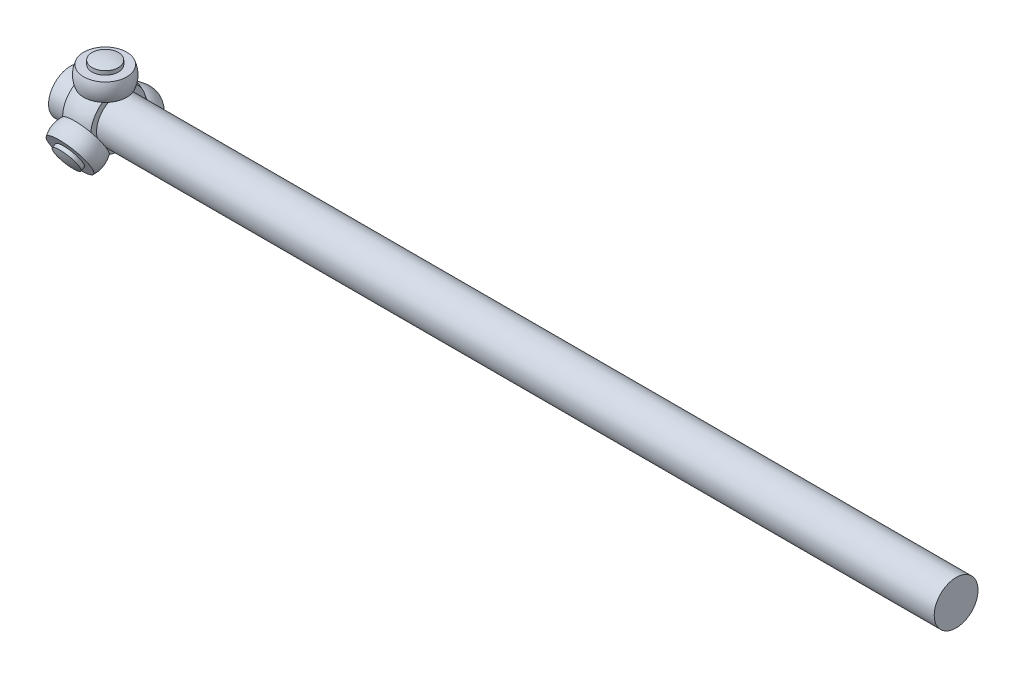
ISO-10303-21;
HEADER;
FILE_DESCRIPTION(('STEP AP214'),'2;1');
FILE_NAME('part.step','',(''),(''),'','','');
FILE_SCHEMA(('AUTOMOTIVE_DESIGN { 1 0 10303 214 1 1 1 1 }'));
ENDSEC;
DATA;
#1=APPLICATION_CONTEXT('core data for automotive mechanical design processes');
#2=APPLICATION_PROTOCOL_DEFINITION('international standard','automotive_design',2000,#1);
#3=PRODUCT_CONTEXT('',#1,'mechanical');
#4=PRODUCT('Part','Part','',(#3));
#5=PRODUCT_RELATED_PRODUCT_CATEGORY('part','',(#4));
#6=PRODUCT_DEFINITION_FORMATION('','',#4);
#7=PRODUCT_DEFINITION_CONTEXT('part definition',#1,'design');
#8=PRODUCT_DEFINITION('design','',#6,#7);
#9=PRODUCT_DEFINITION_SHAPE('','',#8);
#10=(LENGTH_UNIT() NAMED_UNIT(*) SI_UNIT(.MILLI.,.METRE.));
#11=(NAMED_UNIT(*) PLANE_ANGLE_UNIT() SI_UNIT($,.RADIAN.));
#12=(NAMED_UNIT(*) SI_UNIT($,.STERADIAN.) SOLID_ANGLE_UNIT());
#13=UNCERTAINTY_MEASURE_WITH_UNIT(LENGTH_MEASURE(1.E-05),#10,'distance_accuracy_value','');
#14=(GEOMETRIC_REPRESENTATION_CONTEXT(3) GLOBAL_UNCERTAINTY_ASSIGNED_CONTEXT((#13)) GLOBAL_UNIT_ASSIGNED_CONTEXT((#10,
#11,#12)) REPRESENTATION_CONTEXT('',''));
#15=CARTESIAN_POINT('',(0.,0.,0.));
#16=DIRECTION('',(0.,0.,1.));
#17=DIRECTION('',(1.,0.,0.));
#18=AXIS2_PLACEMENT_3D('',#15,#16,#17);
#19=CARTESIAN_POINT('',(0.,0.,0.));
#20=DIRECTION('',(-1.,0.,0.));
#21=DIRECTION('',(0.,1.,0.));
#22=AXIS2_PLACEMENT_3D('',#19,#20,#21);
#23=SPHERICAL_SURFACE('',#22,17.5);
#24=CARTESIAN_POINT('',(7.54091983227916,0.,0.));
#25=DIRECTION('',(-1.,0.,0.));
#26=DIRECTION('',(0.,0.,1.));
#27=AXIS2_PLACEMENT_3D('',#24,#25,#26);
#28=CIRCLE('',#27,15.7919133762549);
#29=CARTESIAN_POINT('',(7.54091983227916,13.11,-8.8041142702227));
#30=VERTEX_POINT('',#29);
#31=CARTESIAN_POINT('',(7.54091983227916,1.06958661583387,-15.7556501787254));
#32=VERTEX_POINT('',#31);
#33=EDGE_CURVE('E108',#30,#32,#28,.T.);
#34=ORIENTED_EDGE('',*,*,#33,.T.);
#35=CARTESIAN_POINT('',(0.,-6.55500000000005,-11.353593043614));
#36=DIRECTION('',(0.,0.500000000000004,0.866025403784436));
#37=DIRECTION('',(0.,-0.866025403784436,0.500000000000004));
#38=AXIS2_PLACEMENT_3D('',#35,#36,#37);
#39=CIRCLE('',#38,11.5921482047117);
#40=CARTESIAN_POINT('',(-9.72222222222222,-1.08762208217728,-14.5101851562304));
#41=VERTEX_POINT('',#40);
#42=EDGE_CURVE('E58',#32,#41,#39,.T.);
#43=ORIENTED_EDGE('',*,*,#42,.T.);
#44=CARTESIAN_POINT('',(-9.72222222222222,0.,0.));
#45=DIRECTION('',(-1.,0.,0.));
#46=DIRECTION('',(0.,0.,1.));
#47=AXIS2_PLACEMENT_3D('',#44,#45,#46);
#48=CIRCLE('',#47,14.5508898374542);
#49=CARTESIAN_POINT('',(-9.72222222222222,13.11,-6.31318422523282));
#50=VERTEX_POINT('',#49);
#51=EDGE_CURVE('E121',#50,#41,#48,.T.);
#52=ORIENTED_EDGE('',*,*,#51,.F.);
#53=CARTESIAN_POINT('',(0.,13.11,0.));
#54=DIRECTION('',(0.,-1.,0.));
#55=DIRECTION('',(0.,0.,-1.));
#56=AXIS2_PLACEMENT_3D('',#53,#54,#55);
#57=CIRCLE('',#56,11.5921482047117);
#58=EDGE_CURVE('E109',#50,#30,#57,.T.);
#59=ORIENTED_EDGE('',*,*,#58,.T.);
#60=EDGE_LOOP('',(#34,#43,#52,#59));
#61=FACE_BOUND('',#60,.T.);
#62=ADVANCED_FACE('F35',(#61),#23,.T.);
#63=CARTESIAN_POINT('',(-9.72222222222222,-12.0223779178228,-8.19700093099754));
#64=VERTEX_POINT('',#63);
#65=CARTESIAN_POINT('',(-9.72222222222222,-12.0223779178227,8.19700093099769));
#66=VERTEX_POINT('',#65);
#67=EDGE_CURVE('E119',#64,#66,#48,.T.);
#68=ORIENTED_EDGE('',*,*,#67,.F.);
#69=CARTESIAN_POINT('',(7.54091983227916,-14.179586615834,-6.95153590850256));
#70=VERTEX_POINT('',#69);
#71=EDGE_CURVE('E136',#64,#70,#39,.T.);
#72=ORIENTED_EDGE('',*,*,#71,.T.);
#73=CARTESIAN_POINT('',(7.54091983227916,-14.1795866158339,6.95153590850278));
#74=VERTEX_POINT('',#73);
#75=EDGE_CURVE('E105',#70,#74,#28,.T.);
#76=ORIENTED_EDGE('',*,*,#75,.T.);
#77=CARTESIAN_POINT('',(0.,-6.55499999999989,11.3535930436141));
#78=DIRECTION('',(0.,0.499999999999992,-0.866025403784443));
#79=DIRECTION('',(0.,0.866025403784443,0.499999999999992));
#80=AXIS2_PLACEMENT_3D('',#77,#78,#79);
#81=CIRCLE('',#80,11.5921482047117);
#82=EDGE_CURVE('E50',#74,#66,#81,.T.);
#83=ORIENTED_EDGE('',*,*,#82,.T.);
#84=EDGE_LOOP('',(#68,#72,#76,#83));
#85=FACE_BOUND('',#84,.T.);
#86=ADVANCED_FACE('F135',(#85),#23,.T.);
#87=CARTESIAN_POINT('',(-9.72222222222222,-1.08762208217707,14.5101851562304));
#88=VERTEX_POINT('',#87);
#89=CARTESIAN_POINT('',(-9.72222222222222,13.11,6.31318422523282));
#90=VERTEX_POINT('',#89);
#91=EDGE_CURVE('E98',#88,#90,#48,.T.);
#92=ORIENTED_EDGE('',*,*,#91,.F.);
#93=CARTESIAN_POINT('',(7.54091983227916,1.06958661583411,15.7556501787253));
#94=VERTEX_POINT('',#93);
#95=EDGE_CURVE('E86',#88,#94,#81,.T.);
#96=ORIENTED_EDGE('',*,*,#95,.T.);
#97=CARTESIAN_POINT('',(7.54091983227916,13.11,8.8041142702227));
#98=VERTEX_POINT('',#97);
#99=EDGE_CURVE('E96',#94,#98,#28,.T.);
#100=ORIENTED_EDGE('',*,*,#99,.T.);
#101=EDGE_CURVE('E106',#98,#90,#57,.T.);
#102=ORIENTED_EDGE('',*,*,#101,.T.);
#103=EDGE_LOOP('',(#92,#96,#100,#102));
#104=FACE_BOUND('',#103,.T.);
#105=ADVANCED_FACE('F37',(#104),#23,.T.);
#106=CARTESIAN_POINT('',(-9.72222222222222,14.5508898374542,0.));
#107=DIRECTION('',(1.,0.,0.));
#108=DIRECTION('',(0.,0.,-1.));
#109=AXIS2_PLACEMENT_3D('',#106,#107,#108);
#110=PLANE('',#109);
#111=CARTESIAN_POINT('',(-9.72222222222222,0.,0.));
#112=DIRECTION('',(-1.,0.,0.));
#113=DIRECTION('',(0.,0.,1.));
#114=AXIS2_PLACEMENT_3D('',#111,#112,#113);
#115=CIRCLE('',#114,12.5);
#116=CARTESIAN_POINT('',(-9.72222222222222,0.,12.5));
#117=VERTEX_POINT('',#116);
#118=EDGE_CURVE('E113',#117,#117,#115,.T.);
#119=ORIENTED_EDGE('',*,*,#118,.F.);
#120=EDGE_LOOP('',(#119));
#121=FACE_BOUND('',#120,.T.);
#122=ORIENTED_EDGE('',*,*,#51,.T.);
#123=DIRECTION('',(0.,-0.866025403784436,0.500000000000004));
#124=VECTOR('',#123,1.);
#125=CARTESIAN_POINT('',(-9.72222222222222,4.35816737809055,-17.6543131670661));
#126=LINE('',#125,#124);
#127=EDGE_CURVE('E132',#41,#64,#126,.T.);
#128=ORIENTED_EDGE('',*,*,#127,.T.);
#129=ORIENTED_EDGE('',*,*,#67,.T.);
#130=DIRECTION('',(0.,0.866025403784443,0.499999999999992));
#131=VECTOR('',#130,1.);
#132=CARTESIAN_POINT('',(-9.72222222222222,4.35816737809088,17.6543131670661));
#133=LINE('',#132,#131);
#134=EDGE_CURVE('E131',#66,#88,#133,.T.);
#135=ORIENTED_EDGE('',*,*,#134,.T.);
#136=ORIENTED_EDGE('',*,*,#91,.T.);
#137=DIRECTION('',(0.,0.,-1.));
#138=VECTOR('',#137,1.);
#139=CARTESIAN_POINT('',(-9.72222222222222,13.11,17.1836611079422));
#140=LINE('',#139,#138);
#141=EDGE_CURVE('E155',#90,#50,#140,.T.);
#142=ORIENTED_EDGE('',*,*,#141,.T.);
#143=EDGE_LOOP('',(#122,#128,#129,#135,#136,#142));
#144=FACE_BOUND('',#143,.T.);
#145=ADVANCED_FACE('F130',(#121,#144),#110,.F.);
#146=CARTESIAN_POINT('',(7.54091983227916,12.5,0.));
#147=DIRECTION('',(-1.,0.,0.));
#148=DIRECTION('',(0.,0.,1.));
#149=AXIS2_PLACEMENT_3D('',#146,#147,#148);
#150=PLANE('',#149);
#151=ORIENTED_EDGE('',*,*,#75,.F.);
#152=DIRECTION('',(0.,0.866025403784436,-0.500000000000004));
#153=VECTOR('',#152,1.);
#154=CARTESIAN_POINT('',(7.54091983227916,2.8199999999999,-16.7662518172667));
#155=LINE('',#154,#153);
#156=EDGE_CURVE('E12',#70,#32,#155,.T.);
#157=ORIENTED_EDGE('',*,*,#156,.T.);
#158=ORIENTED_EDGE('',*,*,#33,.F.);
#159=DIRECTION('',(0.,0.,1.));
#160=VECTOR('',#159,1.);
#161=CARTESIAN_POINT('',(7.54091983227916,13.11,0.));
#162=LINE('',#161,#160);
#163=EDGE_CURVE('E92',#30,#98,#162,.T.);
#164=ORIENTED_EDGE('',*,*,#163,.T.);
#165=ORIENTED_EDGE('',*,*,#99,.F.);
#166=DIRECTION('',(0.,-0.866025403784443,-0.499999999999992));
#167=VECTOR('',#166,1.);
#168=CARTESIAN_POINT('',(7.54091983227916,2.8200000000002,16.7662518172667));
#169=LINE('',#168,#167);
#170=EDGE_CURVE('E43',#94,#74,#169,.T.);
#171=ORIENTED_EDGE('',*,*,#170,.T.);
#172=EDGE_LOOP('',(#151,#157,#158,#164,#165,#171));
#173=FACE_BOUND('',#172,.T.);
#174=CARTESIAN_POINT('',(7.54091983227917,0.,0.));
#175=DIRECTION('',(-1.,0.,0.));
#176=DIRECTION('',(0.,0.,1.));
#177=AXIS2_PLACEMENT_3D('',#174,#175,#176);
#178=CIRCLE('',#177,12.5);
#179=CARTESIAN_POINT('',(7.54091983227917,0.,12.5));
#180=VERTEX_POINT('',#179);
#181=EDGE_CURVE('E250',#180,#180,#178,.T.);
#182=ORIENTED_EDGE('',*,*,#181,.T.);
#183=EDGE_LOOP('',(#182));
#184=FACE_BOUND('',#183,.T.);
#185=ADVANCED_FACE('F102',(#173,#184),#150,.F.);
#186=CARTESIAN_POINT('',(0.,13.11,-7.47850270471022));
#187=DIRECTION('',(0.,1.,0.));
#188=DIRECTION('',(0.,0.,1.));
#189=AXIS2_PLACEMENT_3D('',#186,#187,#188);
#190=PLANE('',#189);
#191=CARTESIAN_POINT('',(0.,13.11,0.));
#192=DIRECTION('',(0.,1.,0.));
#193=DIRECTION('',(0.,0.,1.));
#194=AXIS2_PLACEMENT_3D('',#191,#192,#193);
#195=CIRCLE('',#194,12.2540156683432);
#196=CARTESIAN_POINT('',(0.,13.11,-12.2540156683432));
#197=VERTEX_POINT('',#196);
#198=EDGE_CURVE('E149',#197,#197,#195,.T.);
#199=ORIENTED_EDGE('',*,*,#198,.F.);
#200=EDGE_LOOP('',(#199));
#201=FACE_BOUND('',#200,.T.);
#202=ORIENTED_EDGE('',*,*,#58,.F.);
#203=ORIENTED_EDGE('',*,*,#141,.F.);
#204=ORIENTED_EDGE('',*,*,#101,.F.);
#205=ORIENTED_EDGE('',*,*,#163,.F.);
#206=EDGE_LOOP('',(#202,#203,#204,#205));
#207=FACE_BOUND('',#206,.T.);
#208=ADVANCED_FACE('F188',(#201,#207),#190,.F.);
#209=CARTESIAN_POINT('',(0.,18.15,0.));
#210=DIRECTION('',(0.,1.,0.));
#211=DIRECTION('',(0.,0.,-1.));
#212=AXIS2_PLACEMENT_3D('',#209,#210,#211);
#213=SPHERICAL_SURFACE('',#212,13.25);
#214=CARTESIAN_POINT('',(0.,23.19,0.));
#215=DIRECTION('',(0.,1.,0.));
#216=DIRECTION('',(0.,0.,1.));
#217=AXIS2_PLACEMENT_3D('',#214,#215,#216);
#218=CIRCLE('',#217,12.2540156683432);
#219=CARTESIAN_POINT('',(0.,23.19,-12.2540156683432));
#220=VERTEX_POINT('',#219);
#221=EDGE_CURVE('E146',#220,#220,#218,.T.);
#222=CARTESIAN_POINT('',(0.,23.19,-12.2540156683432));
#223=CARTESIAN_POINT('',(0.,23.0903840691902,-12.2949873808712));
#224=CARTESIAN_POINT('',(0.,22.9902683386837,-12.3347438730989));
#225=CARTESIAN_POINT('',(0.,22.7890972612106,-12.4118039229785));
#226=CARTESIAN_POINT('',(0.,22.688041914244,-12.4491074806305));
#227=CARTESIAN_POINT('',(0.,22.4850515867848,-12.5212391673838));
#228=CARTESIAN_POINT('',(0.,22.3831166062921,-12.5560672964851));
#229=CARTESIAN_POINT('',(0.,22.1784276675977,-12.6232274952789));
#230=CARTESIAN_POINT('',(0.,22.075673709396,-12.6555595649714));
#231=CARTESIAN_POINT('',(0.,21.8694079180531,-12.7177083938399));
#232=CARTESIAN_POINT('',(0.,21.7658960849119,-12.7475251530158));
#233=CARTESIAN_POINT('',(0.,21.5581761079436,-12.8046256337488));
#234=CARTESIAN_POINT('',(0.,21.4539679641166,-12.8319093553057));
#235=CARTESIAN_POINT('',(0.,21.2449173412693,-12.8839275326611));
#236=CARTESIAN_POINT('',(0.,21.140074862249,-12.9086619884596));
#237=CARTESIAN_POINT('',(0.,20.9298179225403,-12.9555669243079));
#238=CARTESIAN_POINT('',(0.,20.8244034618518,-12.9777374043577));
#239=CARTESIAN_POINT('',(0.,20.6130652523017,-13.0195012030616));
#240=CARTESIAN_POINT('',(0.,20.5071415034401,-13.0390945217157));
#241=CARTESIAN_POINT('',(0.,20.2948477139849,-13.0756923448507));
#242=CARTESIAN_POINT('',(0.,20.1884776733914,-13.0926968493315));
#243=CARTESIAN_POINT('',(0.,19.9753545623237,-13.1241069309589));
#244=CARTESIAN_POINT('',(0.,19.8686014918495,-13.1385125081054));
#245=CARTESIAN_POINT('',(0.,19.6547758106764,-13.1647161675831));
#246=CARTESIAN_POINT('',(0.,19.5477031999776,-13.1765142499144));
#247=CARTESIAN_POINT('',(0.,19.3333021180514,-13.1974959030431));
#248=CARTESIAN_POINT('',(0.,19.2259736468242,-13.2066794738407));
#249=CARTESIAN_POINT('',(0.,19.0111246757067,-13.2224266421226));
#250=CARTESIAN_POINT('',(0.,18.9036041758166,-13.228990239607));
#251=CARTESIAN_POINT('',(0.,18.6884350934446,-13.2394935576695));
#252=CARTESIAN_POINT('',(0.,18.5807865109628,-13.2434332782476));
#253=CARTESIAN_POINT('',(0.,18.365425285654,-13.2486864994129));
#254=CARTESIAN_POINT('',(0.,18.257712642827,-13.25));
#255=CARTESIAN_POINT('',(0.,18.042287357173,-13.25));
#256=CARTESIAN_POINT('',(0.,17.934574714346,-13.2486864994129));
#257=CARTESIAN_POINT('',(0.,17.7192134890372,-13.2434332782476));
#258=CARTESIAN_POINT('',(0.,17.6115649065554,-13.2394935576695));
#259=CARTESIAN_POINT('',(0.,17.3963958241834,-13.228990239607));
#260=CARTESIAN_POINT('',(0.,17.2888753242933,-13.2224266421226));
#261=CARTESIAN_POINT('',(0.,17.0740263531758,-13.2066794738407));
#262=CARTESIAN_POINT('',(0.,16.9666978819486,-13.1974959030431));
#263=CARTESIAN_POINT('',(0.,16.7522968000224,-13.1765142499144));
#264=CARTESIAN_POINT('',(0.,16.6452241893236,-13.1647161675831));
#265=CARTESIAN_POINT('',(0.,16.4313985081505,-13.1385125081054));
#266=CARTESIAN_POINT('',(0.,16.3246454376763,-13.1241069309589));
#267=CARTESIAN_POINT('',(0.,16.1115223266086,-13.0926968493315));
#268=CARTESIAN_POINT('',(0.,16.0051522860151,-13.0756923448507));
#269=CARTESIAN_POINT('',(0.,15.7928584965599,-13.0390945217157));
#270=CARTESIAN_POINT('',(0.,15.6869347476983,-13.0195012030616));
#271=CARTESIAN_POINT('',(0.,15.4755965381482,-12.9777374043577));
#272=CARTESIAN_POINT('',(0.,15.3701820774597,-12.9555669243079));
#273=CARTESIAN_POINT('',(0.,15.159925137751,-12.9086619884596));
#274=CARTESIAN_POINT('',(0.,15.0550826587307,-12.8839275326611));
#275=CARTESIAN_POINT('',(0.,14.8460320358834,-12.8319093553057));
#276=CARTESIAN_POINT('',(0.,14.7418238920564,-12.8046256337487));
#277=CARTESIAN_POINT('',(0.,14.5341039150881,-12.7475251530158));
#278=CARTESIAN_POINT('',(0.,14.4305920819469,-12.7177083938398));
#279=CARTESIAN_POINT('',(0.,14.224326290604,-12.6555595649714));
#280=CARTESIAN_POINT('',(0.,14.1215723324023,-12.6232274952789));
#281=CARTESIAN_POINT('',(0.,13.9168833937079,-12.5560672964851));
#282=CARTESIAN_POINT('',(0.,13.8149484132152,-12.5212391673838));
#283=CARTESIAN_POINT('',(0.,13.6119580857559,-12.4491074806305));
#284=CARTESIAN_POINT('',(0.,13.5109027387894,-12.4118039229785));
#285=CARTESIAN_POINT('',(0.,13.3097316613163,-12.3347438730989));
#286=CARTESIAN_POINT('',(0.,13.2096159308098,-12.2949873808712));
#287=CARTESIAN_POINT('',(0.,13.11,-12.2540156683432));
#288=B_SPLINE_CURVE_WITH_KNOTS('',3,(#222,#223,#224,#225,#226,#227,#228,#229,#230,#231,#232,
#233,#234,#235,#236,#237,#238,#239,#240,#241,#242,#243,#244,#245,#246,#247,#248,#249,#250,#251,
#252,#253,#254,#255,#256,#257,#258,#259,#260,#261,#262,#263,#264,#265,#266,#267,#268,#269,#270,
#271,#272,#273,#274,#275,#276,#277,#278,#279,#280,#281,#282,#283,#284,#285,#286,#287),
.UNSPECIFIED.,.F.,.F.,(4,2,2,2,2,2,2,2,2,2,2,2,2,2,2,2,2,2,2,2,2,2,2,2,2,2,2,2,2,2,2,2,4),(0.,
0.323129921235588,0.646259842471182,0.969389763706772,1.29251968494236,1.61564960617796,
1.93877952741355,2.26190944864914,2.58503936988473,2.90816929112032,3.23129921235591,
3.5544291335915,3.87755905482709,4.20068897606268,4.52381889729827,4.84694881853386,
5.17007873976946,5.49320866100505,5.81633858224064,6.13946850347623,6.46259842471182,
6.78572834594741,7.10885826718301,7.4319881884186,7.75511810965419,8.07824803088978,
8.40137795212537,8.72450787336096,9.04763779459655,9.37076771583214,9.69389763706773,
10.0170275583033,10.3401574795389),.UNSPECIFIED.);
#289=EDGE_CURVE('BSEAM197',#220,#197,#288,.T.);
#290=ORIENTED_EDGE('',*,*,#221,.F.);
#291=ORIENTED_EDGE('',*,*,#198,.T.);
#292=ORIENTED_EDGE('',*,*,#289,.T.);
#293=ORIENTED_EDGE('',*,*,#289,.F.);
#294=EDGE_LOOP('',(#290,#292,#291,#293));
#295=FACE_BOUND('',#294,.T.);
#296=ADVANCED_FACE('F197',(#295),#213,.T.);
#297=CARTESIAN_POINT('',(0.,23.19,-7.47850270471022));
#298=DIRECTION('',(0.,-1.,0.));
#299=DIRECTION('',(0.,0.,-1.));
#300=AXIS2_PLACEMENT_3D('',#297,#298,#299);
#301=PLANE('',#300);
#302=CARTESIAN_POINT('',(0.,23.19,0.));
#303=DIRECTION('',(0.,1.,0.));
#304=DIRECTION('',(0.,0.,1.));
#305=AXIS2_PLACEMENT_3D('',#302,#303,#304);
#306=CIRCLE('',#305,7.47850270471022);
#307=CARTESIAN_POINT('',(0.,23.19,7.47850270471022));
#308=VERTEX_POINT('',#307);
#309=EDGE_CURVE('E143',#308,#308,#306,.T.);
#310=ORIENTED_EDGE('',*,*,#309,.F.);
#311=EDGE_LOOP('',(#310));
#312=FACE_BOUND('',#311,.T.);
#313=ORIENTED_EDGE('',*,*,#221,.T.);
#314=EDGE_LOOP('',(#313));
#315=FACE_BOUND('',#314,.T.);
#316=ADVANCED_FACE('F193',(#312,#315),#301,.F.);
#317=CARTESIAN_POINT('',(0.,0.,0.));
#318=DIRECTION('',(0.,-1.,0.));
#319=DIRECTION('',(0.,0.,-1.));
#320=AXIS2_PLACEMENT_3D('',#317,#318,#319);
#321=SPHERICAL_SURFACE('',#320,26.5);
#322=CARTESIAN_POINT('',(0.,25.4228636722074,0.));
#323=DIRECTION('',(0.,-1.,0.));
#324=DIRECTION('',(0.,0.,-1.));
#325=AXIS2_PLACEMENT_3D('',#322,#323,#324);
#326=CIRCLE('',#325,7.47850270471022);
#327=CARTESIAN_POINT('',(0.,25.4228636722074,-7.47850270471022));
#328=VERTEX_POINT('',#327);
#329=EDGE_CURVE('E152',#328,#328,#326,.T.);
#330=ORIENTED_EDGE('',*,*,#329,.F.);
#331=EDGE_LOOP('',(#330));
#332=FACE_BOUND('',#331,.T.);
#333=ADVANCED_FACE('F171',(#332),#321,.T.);
#334=CARTESIAN_POINT('',(0.,13.11,0.));
#335=DIRECTION('',(0.,1.,0.));
#336=DIRECTION('',(0.,0.,1.));
#337=AXIS2_PLACEMENT_3D('',#334,#335,#336);
#338=CYLINDRICAL_SURFACE('',#337,7.47850270471022);
#339=ORIENTED_EDGE('',*,*,#329,.T.);
#340=EDGE_LOOP('',(#339));
#341=FACE_BOUND('',#340,.T.);
#342=ORIENTED_EDGE('',*,*,#309,.T.);
#343=EDGE_LOOP('',(#342));
#344=FACE_BOUND('',#343,.T.);
#345=ADVANCED_FACE('F161',(#341,#344),#338,.T.);
#346=CARTESIAN_POINT('',(0.,-13.0315733245497,-7.61434169125882));
#347=DIRECTION('',(0.,-0.500000000000004,-0.866025403784436));
#348=DIRECTION('',(0.,0.866025403784436,-0.500000000000004));
#349=AXIS2_PLACEMENT_3D('',#346,#347,#348);
#350=PLANE('',#349);
#351=CARTESIAN_POINT('',(0.,-6.55500000000005,-11.353593043614));
#352=DIRECTION('',(0.,-0.500000000000004,-0.866025403784436));
#353=DIRECTION('',(0.,0.866025403784436,-0.500000000000004));
#354=AXIS2_PLACEMENT_3D('',#351,#352,#353);
#355=CIRCLE('',#354,12.2540156683432);
#356=CARTESIAN_POINT('',(0.,-17.1672888671578,-5.22658520944232));
#357=VERTEX_POINT('',#356);
#358=EDGE_CURVE('E230',#357,#357,#355,.T.);
#359=ORIENTED_EDGE('',*,*,#358,.F.);
#360=EDGE_LOOP('',(#359));
#361=FACE_BOUND('',#360,.T.);
#362=ORIENTED_EDGE('',*,*,#71,.F.);
#363=ORIENTED_EDGE('',*,*,#127,.F.);
#364=ORIENTED_EDGE('',*,*,#42,.F.);
#365=ORIENTED_EDGE('',*,*,#156,.F.);
#366=EDGE_LOOP('',(#362,#363,#364,#365));
#367=FACE_BOUND('',#366,.T.);
#368=ADVANCED_FACE('F158',(#361,#367),#350,.F.);
#369=CARTESIAN_POINT('',(0.,-9.07500000000008,-15.7183610786875));
#370=DIRECTION('',(0.,-0.500000000000004,-0.866025403784436));
#371=DIRECTION('',(0.,-0.866025403784436,0.500000000000004));
#372=AXIS2_PLACEMENT_3D('',#369,#370,#371);
#373=SPHERICAL_SURFACE('',#372,13.25);
#374=CARTESIAN_POINT('',(0.,-11.5950000000001,-20.0831291137611));
#375=DIRECTION('',(0.,-0.500000000000004,-0.866025403784436));
#376=DIRECTION('',(0.,0.866025403784436,-0.500000000000004));
#377=AXIS2_PLACEMENT_3D('',#374,#375,#376);
#378=CIRCLE('',#377,12.2540156683432);
#379=CARTESIAN_POINT('',(0.,-22.2072888671578,-13.9561212795894));
#380=VERTEX_POINT('',#379);
#381=EDGE_CURVE('E233',#380,#380,#378,.T.);
#382=CARTESIAN_POINT('',(0.,-22.2072888671578,-13.9561212795894));
#383=CARTESIAN_POINT('',(0.,-22.1929634456387,-13.8493654966225));
#384=CARTESIAN_POINT('',(0.,-22.17733571262,-13.7427844845716));
#385=CARTESIAN_POINT('',(0.,-22.1434861346961,-13.5300351960334));
#386=CARTESIAN_POINT('',(0.,-22.125264289791,-13.4238669195461));
#387=CARTESIAN_POINT('',(0.,-22.0862369992076,-13.2120062958672));
#388=CARTESIAN_POINT('',(0.,-22.0654315535292,-13.1063139486756));
#389=CARTESIAN_POINT('',(0.,-22.0212495224607,-12.8954680284957));
#390=CARTESIAN_POINT('',(0.,-21.9978729370705,-12.7903144555074));
#391=CARTESIAN_POINT('',(0.,-21.9485625060145,-12.5806086258385));
#392=CARTESIAN_POINT('',(0.,-21.9226286603488,-12.476056369158));
#393=CARTESIAN_POINT('',(0.,-21.8682191387477,-12.2676153518634));
#394=CARTESIAN_POINT('',(0.,-21.8397434628123,-12.1637265912495));
#395=CARTESIAN_POINT('',(0.,-21.780267214437,-11.9566743525091));
#396=CARTESIAN_POINT('',(0.,-21.7492666419971,-11.8535108743825));
#397=CARTESIAN_POINT('',(0.,-21.6847590381502,-11.6479705553487));
#398=CARTESIAN_POINT('',(0.,-21.6512520067432,-11.5455937144413));
#399=CARTESIAN_POINT('',(0.,-21.5817514126043,-11.3416875568286));
#400=CARTESIAN_POINT('',(0.,-21.5457578498724,-11.2401582401233));
#401=CARTESIAN_POINT('',(0.,-21.4713055997029,-11.038007513822));
#402=CARTESIAN_POINT('',(0.,-21.4328469122653,-10.937386104226));
#403=CARTESIAN_POINT('',(0.,-21.3534872853557,-10.7371110350941));
#404=CARTESIAN_POINT('',(0.,-21.3125863458836,-10.6374573755583));
#405=CARTESIAN_POINT('',(0.,-21.228366540077,-10.439177073942));
#406=CARTESIAN_POINT('',(0.,-21.1850476737423,-10.3405504318616));
#407=CARTESIAN_POINT('',(0.,-21.0960177774022,-10.1443828217504));
#408=CARTESIAN_POINT('',(0.,-21.0503067473967,-10.0468418537194));
#409=CARTESIAN_POINT('',(0.,-20.9565197096078,-9.85290360261384));
#410=CARTESIAN_POINT('',(0.,-20.9084437018244,-9.75650631953916));
#411=CARTESIAN_POINT('',(0.,-20.8099553009045,-9.56491276906479));
#412=CARTESIAN_POINT('',(0.,-20.7595429077681,-9.4697165016651));
#413=CARTESIAN_POINT('',(0.,-20.6564117180946,-9.28058159897492));
#414=CARTESIAN_POINT('',(0.,-20.6036929215574,-9.18664296368442));
#415=CARTESIAN_POINT('',(0.,-20.4959802787303,-9.00007919369052));
#416=CARTESIAN_POINT('',(0.,-20.4409864324405,-8.90745405898712));
#417=CARTESIAN_POINT('',(0.,-20.3287563968053,-8.72357237746218));
#418=CARTESIAN_POINT('',(0.,-20.2715202074599,-8.63231583064065));
#419=CARTESIAN_POINT('',(0.,-20.1548395260078,-8.4512255982288));
#420=CARTESIAN_POINT('',(0.,-20.095395033901,-8.3613919126385));
#421=CARTESIAN_POINT('',(0.,-19.9743331005725,-8.1832008298148));
#422=CARTESIAN_POINT('',(0.,-19.9127156593507,-8.09484343258142));
#423=CARTESIAN_POINT('',(0.,-19.7873444737648,-7.91965747559893));
#424=CARTESIAN_POINT('',(0.,-19.7235907294005,-7.83282891584982));
#425=CARTESIAN_POINT('',(0.,-19.5939848540342,-7.66075227371131));
#426=CARTESIAN_POINT('',(0.,-19.528132723032,-7.57550419132192));
#427=CARTESIAN_POINT('',(0.,-19.3943692388739,-7.40663920381738));
#428=CARTESIAN_POINT('',(0.,-19.326457885718,-7.32302229870224));
#429=CARTESIAN_POINT('',(0.,-19.1886163464323,-7.15746939553588));
#430=CARTESIAN_POINT('',(0.,-19.1186861603026,-7.07553339748466));
#431=CARTESIAN_POINT('',(0.,-18.9768485448914,-6.91339103857592));
#432=CARTESIAN_POINT('',(0.,-18.90494111561,-6.83318467771839));
#433=CARTESIAN_POINT('',(0.,-18.7591917797481,-6.6745492945328));
#434=CARTESIAN_POINT('',(0.,-18.6853498731677,-6.59612027220474));
#435=CARTESIAN_POINT('',(0.,-18.5357754986957,-6.44108621081971));
#436=CARTESIAN_POINT('',(0.,-18.4600430308041,-6.36448117176274));
#437=CARTESIAN_POINT('',(0.,-18.3067325754369,-6.21314063520115));
#438=CARTESIAN_POINT('',(0.,-18.2291545879614,-6.13840513769654));
#439=CARTESIAN_POINT('',(0.,-18.0721992276744,-5.99084813689611));
#440=CARTESIAN_POINT('',(0.,-17.992821854863,-5.9180266336003));
#441=CARTESIAN_POINT('',(0.,-17.8323149472371,-5.77434091221418));
#442=CARTESIAN_POINT('',(0.,-17.7511854124227,-5.70347669412388));
#443=CARTESIAN_POINT('',(0.,-17.5872223755469,-5.56374775719832));
#444=CARTESIAN_POINT('',(0.,-17.5043888734855,-5.49488303836307));
#445=CARTESIAN_POINT('',(0.,-17.3370673739363,-5.3591937997045));
#446=CARTESIAN_POINT('',(0.,-17.2525793764485,-5.2923692798812));
#447=CARTESIAN_POINT('',(0.,-17.1672888671578,-5.22658520944232));
#448=B_SPLINE_CURVE_WITH_KNOTS('',3,(#382,#383,#384,#385,#386,#387,#388,#389,#390,#391,#392,
#393,#394,#395,#396,#397,#398,#399,#400,#401,#402,#403,#404,#405,#406,#407,#408,#409,#410,#411,
#412,#413,#414,#415,#416,#417,#418,#419,#420,#421,#422,#423,#424,#425,#426,#427,#428,#429,#430,
#431,#432,#433,#434,#435,#436,#437,#438,#439,#440,#441,#442,#443,#444,#445,#446,#447),
.UNSPECIFIED.,.F.,.F.,(4,2,2,2,2,2,2,2,2,2,2,2,2,2,2,2,2,2,2,2,2,2,2,2,2,2,2,2,2,2,2,2,4),(0.,
0.323129921235591,0.646259842471183,0.969389763706774,1.29251968494237,1.61564960617796,
1.93877952741355,2.26190944864914,2.58503936988473,2.90816929112032,3.23129921235591,
3.5544291335915,3.87755905482709,4.20068897606269,4.52381889729828,4.84694881853387,
5.17007873976946,5.49320866100505,5.81633858224064,6.13946850347623,6.46259842471182,
6.78572834594741,7.10885826718301,7.4319881884186,7.75511810965419,8.07824803088978,
8.40137795212537,8.72450787336096,9.04763779459655,9.37076771583214,9.69389763706773,
10.0170275583033,10.3401574795389),.UNSPECIFIED.);
#449=EDGE_CURVE('BSEAM160',#380,#357,#448,.T.);
#450=ORIENTED_EDGE('',*,*,#381,.F.);
#451=ORIENTED_EDGE('',*,*,#358,.T.);
#452=ORIENTED_EDGE('',*,*,#449,.T.);
#453=ORIENTED_EDGE('',*,*,#449,.F.);
#454=EDGE_LOOP('',(#450,#452,#451,#453));
#455=FACE_BOUND('',#454,.T.);
#456=ADVANCED_FACE('F160',(#455),#373,.T.);
#457=CARTESIAN_POINT('',(0.,-18.0715733245498,-16.3438777614059));
#458=DIRECTION('',(0.,0.500000000000004,0.866025403784436));
#459=DIRECTION('',(0.,-0.866025403784436,0.500000000000004));
#460=AXIS2_PLACEMENT_3D('',#457,#458,#459);
#461=PLANE('',#460);
#462=CARTESIAN_POINT('',(0.,-11.5950000000001,-20.0831291137611));
#463=DIRECTION('',(0.,-0.500000000000004,-0.866025403784436));
#464=DIRECTION('',(0.,0.866025403784436,-0.500000000000004));
#465=AXIS2_PLACEMENT_3D('',#462,#463,#464);
#466=CIRCLE('',#465,7.47850270471022);
#467=CARTESIAN_POINT('',(0.,-5.11842667545043,-23.8223804661162));
#468=VERTEX_POINT('',#467);
#469=EDGE_CURVE('E238',#468,#468,#466,.T.);
#470=ORIENTED_EDGE('',*,*,#469,.F.);
#471=EDGE_LOOP('',(#470));
#472=FACE_BOUND('',#471,.T.);
#473=ORIENTED_EDGE('',*,*,#381,.T.);
#474=EDGE_LOOP('',(#473));
#475=FACE_BOUND('',#474,.T.);
#476=ADVANCED_FACE('F168',(#472,#475),#461,.F.);
#477=CARTESIAN_POINT('',(0.,0.,0.));
#478=DIRECTION('',(0.,0.500000000000004,0.866025403784436));
#479=DIRECTION('',(0.,-0.866025403784436,0.500000000000004));
#480=AXIS2_PLACEMENT_3D('',#477,#478,#479);
#481=SPHERICAL_SURFACE('',#480,26.5);
#482=CARTESIAN_POINT('',(0.,-12.7114318361038,-22.0168457770801));
#483=DIRECTION('',(0.,0.500000000000004,0.866025403784436));
#484=DIRECTION('',(0.,-0.866025403784436,0.500000000000004));
#485=AXIS2_PLACEMENT_3D('',#482,#483,#484);
#486=CIRCLE('',#485,7.47850270471022);
#487=CARTESIAN_POINT('',(0.,-19.1880051606535,-18.2775944247249));
#488=VERTEX_POINT('',#487);
#489=EDGE_CURVE('E99',#488,#488,#486,.T.);
#490=ORIENTED_EDGE('',*,*,#489,.F.);
#491=EDGE_LOOP('',(#490));
#492=FACE_BOUND('',#491,.T.);
#493=ADVANCED_FACE('F208',(#492),#481,.T.);
#494=CARTESIAN_POINT('',(0.,-6.55500000000005,-11.353593043614));
#495=DIRECTION('',(0.,-0.500000000000004,-0.866025403784436));
#496=DIRECTION('',(0.,0.866025403784436,-0.500000000000004));
#497=AXIS2_PLACEMENT_3D('',#494,#495,#496);
#498=CYLINDRICAL_SURFACE('',#497,7.47850270471022);
#499=ORIENTED_EDGE('',*,*,#489,.T.);
#500=EDGE_LOOP('',(#499));
#501=FACE_BOUND('',#500,.T.);
#502=ORIENTED_EDGE('',*,*,#469,.T.);
#503=EDGE_LOOP('',(#502));
#504=FACE_BOUND('',#503,.T.);
#505=ADVANCED_FACE('F205',(#501,#504),#498,.T.);
#506=CARTESIAN_POINT('',(0.,-0.0784266754501753,15.0928443959691));
#507=DIRECTION('',(0.,-0.499999999999992,0.866025403784443));
#508=DIRECTION('',(0.,-0.866025403784443,-0.499999999999992));
#509=AXIS2_PLACEMENT_3D('',#506,#507,#508);
#510=PLANE('',#509);
#511=CARTESIAN_POINT('',(0.,-6.55499999999989,11.353593043614));
#512=DIRECTION('',(0.,-0.499999999999992,0.866025403784443));
#513=DIRECTION('',(0.,-0.866025403784443,-0.499999999999992));
#514=AXIS2_PLACEMENT_3D('',#511,#512,#513);
#515=CIRCLE('',#514,12.2540156683432);
#516=CARTESIAN_POINT('',(0.,4.05728886715789,17.4806008777855));
#517=VERTEX_POINT('',#516);
#518=EDGE_CURVE('E241',#517,#517,#515,.T.);
#519=ORIENTED_EDGE('',*,*,#518,.F.);
#520=EDGE_LOOP('',(#519));
#521=FACE_BOUND('',#520,.T.);
#522=ORIENTED_EDGE('',*,*,#95,.F.);
#523=ORIENTED_EDGE('',*,*,#134,.F.);
#524=ORIENTED_EDGE('',*,*,#82,.F.);
#525=ORIENTED_EDGE('',*,*,#170,.F.);
#526=EDGE_LOOP('',(#522,#523,#524,#525));
#527=FACE_BOUND('',#526,.T.);
#528=ADVANCED_FACE('F85',(#521,#527),#510,.F.);
#529=CARTESIAN_POINT('',(0.,-9.07499999999986,15.7183610786876));
#530=DIRECTION('',(0.,-0.499999999999992,0.866025403784443));
#531=DIRECTION('',(0.,0.866025403784443,0.499999999999992));
#532=AXIS2_PLACEMENT_3D('',#529,#530,#531);
#533=SPHERICAL_SURFACE('',#532,13.25);
#534=CARTESIAN_POINT('',(0.,-11.5949999999998,20.0831291137612));
#535=DIRECTION('',(0.,-0.499999999999992,0.866025403784443));
#536=DIRECTION('',(0.,-0.866025403784443,-0.499999999999992));
#537=AXIS2_PLACEMENT_3D('',#534,#535,#536);
#538=CIRCLE('',#537,12.2540156683432);
#539=CARTESIAN_POINT('',(0.,-0.98271113284203,26.2101369479327));
#540=VERTEX_POINT('',#539);
#541=EDGE_CURVE('E244',#540,#540,#538,.T.);
#542=CARTESIAN_POINT('',(0.,-0.98271113284203,26.2101369479327));
#543=CARTESIAN_POINT('',(0.,-0.897420623551322,26.1443528774939));
#544=CARTESIAN_POINT('',(0.,-0.812932626063513,26.0775283576705));
#545=CARTESIAN_POINT('',(0.,-0.645611126514296,25.941839119012));
#546=CARTESIAN_POINT('',(0.,-0.562777624452889,25.8729744001767));
#547=CARTESIAN_POINT('',(0.,-0.398814587577081,25.7332454632512));
#548=CARTESIAN_POINT('',(0.,-0.31768505276268,25.6623812451609));
#549=CARTESIAN_POINT('',(0.,-0.157178145136839,25.5186955237747));
#550=CARTESIAN_POINT('',(0.,-0.0778007723253985,25.4458740204789));
#551=CARTESIAN_POINT('',(0.,0.0791545879615641,25.2983170196785));
#552=CARTESIAN_POINT('',(0.,0.156732575437087,25.2235815221739));
#553=CARTESIAN_POINT('',(0.,0.310043030804251,25.0722409856123));
#554=CARTESIAN_POINT('',(0.,0.385775498695893,24.9956359465553));
#555=CARTESIAN_POINT('',(0.,0.535349873167913,24.8406018851703));
#556=CARTESIAN_POINT('',(0.,0.609191779748292,24.7621728628422));
#557=CARTESIAN_POINT('',(0.,0.754941115610144,24.6035374796566));
#558=CARTESIAN_POINT('',(0.,0.826848544891618,24.5233311187991));
#559=CARTESIAN_POINT('',(0.,0.968686160302808,24.3611887598904));
#560=CARTESIAN_POINT('',(0.,1.03861634643252,24.2792527618391));
#561=CARTESIAN_POINT('',(0.,1.17645788571818,24.1136998586728));
#562=CARTESIAN_POINT('',(0.,1.24436923887412,24.0300829535576));
#563=CARTESIAN_POINT('',(0.,1.3781327230322,23.8612179660531));
#564=CARTESIAN_POINT('',(0.,1.44398485403433,23.7759698836637));
#565=CARTESIAN_POINT('',(0.,1.5735907294007,23.6038932415252));
#566=CARTESIAN_POINT('',(0.,1.63734447376494,23.5170646817761));
#567=CARTESIAN_POINT('',(0.,1.76271565935092,23.3418787247936));
#568=CARTESIAN_POINT('',(0.,1.82433310057267,23.2535213275602));
#569=CARTESIAN_POINT('',(0.,1.94539503390118,23.0753302447365));
#570=CARTESIAN_POINT('',(0.,2.00483952600796,22.9854965591462));
#571=CARTESIAN_POINT('',(0.,2.12152020746011,22.8044063267344));
#572=CARTESIAN_POINT('',(0.,2.17875639680549,22.7131497799128));
#573=CARTESIAN_POINT('',(0.,2.29098643244069,22.5292680983879));
#574=CARTESIAN_POINT('',(0.,2.34598027873051,22.4366429636845));
#575=CARTESIAN_POINT('',(0.,2.45369292155752,22.2500791936906));
#576=CARTESIAN_POINT('',(0.,2.50641171809471,22.1561405584001));
#577=CARTESIAN_POINT('',(0.,2.6095429077683,21.9670056557099));
#578=CARTESIAN_POINT('',(0.,2.6599553009047,21.8718093883102));
#579=CARTESIAN_POINT('',(0.,2.75844370182451,21.6802158378358));
#580=CARTESIAN_POINT('',(0.,2.80651970960791,21.5838185547612));
#581=CARTESIAN_POINT('',(0.,2.90030674739682,21.3898803036555));
#582=CARTESIAN_POINT('',(0.,2.94601777740233,21.2923393356246));
#583=CARTESIAN_POINT('',(0.,3.03504767374247,21.0961717255133));
#584=CARTESIAN_POINT('',(0.,3.07836654007709,20.997545083433));
#585=CARTESIAN_POINT('',(0.,3.16258634588378,20.7992647818167));
#586=CARTESIAN_POINT('',(0.,3.20348728535583,20.6996111222808));
#587=CARTESIAN_POINT('',(0.,3.28284691226546,20.499336053149));
#588=CARTESIAN_POINT('',(0.,3.32130559970304,20.398714643553));
#589=CARTESIAN_POINT('',(0.,3.39575784987254,20.1965639172517));
#590=CARTESIAN_POINT('',(0.,3.43175141260446,20.0950346005463));
#591=CARTESIAN_POINT('',(0.,3.50125200674337,19.8911284429337));
#592=CARTESIAN_POINT('',(0.,3.53475903815036,19.7887516020263));
#593=CARTESIAN_POINT('',(0.,3.59926664199723,19.5832112829924));
#594=CARTESIAN_POINT('',(0.,3.63026721443712,19.4800478048659));
#595=CARTESIAN_POINT('',(0.,3.68974346281242,19.2729955661255));
#596=CARTESIAN_POINT('',(0.,3.71821913874783,19.1691068055115));
#597=CARTESIAN_POINT('',(0.,3.77262866034895,18.960665788217));
#598=CARTESIAN_POINT('',(0.,3.79856250601465,18.8561135315364));
#599=CARTESIAN_POINT('',(0.,3.84787293707058,18.6464077018676));
#600=CARTESIAN_POINT('',(0.,3.87124952246081,18.5412541288793));
#601=CARTESIAN_POINT('',(0.,3.91543155352935,18.3304082086994));
#602=CARTESIAN_POINT('',(0.,3.93623699920767,18.2247158615077));
#603=CARTESIAN_POINT('',(0.,3.97526428979109,18.0128552378289));
#604=CARTESIAN_POINT('',(0.,3.99348613469619,17.9066869613416));
#605=CARTESIAN_POINT('',(0.,4.02733571262007,17.6939376728034));
#606=CARTESIAN_POINT('',(0.,4.04296344563884,17.5873566607524));
#607=CARTESIAN_POINT('',(0.,4.05728886715789,17.4806008777855));
#608=B_SPLINE_CURVE_WITH_KNOTS('',3,(#542,#543,#544,#545,#546,#547,#548,#549,#550,#551,#552,
#553,#554,#555,#556,#557,#558,#559,#560,#561,#562,#563,#564,#565,#566,#567,#568,#569,#570,#571,
#572,#573,#574,#575,#576,#577,#578,#579,#580,#581,#582,#583,#584,#585,#586,#587,#588,#589,#590,
#591,#592,#593,#594,#595,#596,#597,#598,#599,#600,#601,#602,#603,#604,#605,#606,#607),
.UNSPECIFIED.,.F.,.F.,(4,2,2,2,2,2,2,2,2,2,2,2,2,2,2,2,2,2,2,2,2,2,2,2,2,2,2,2,2,2,2,2,4),(0.,
0.323129921235594,0.646259842471185,0.969389763706776,1.29251968494237,1.61564960617796,
1.93877952741355,2.26190944864914,2.58503936988473,2.90816929112032,3.23129921235592,
3.55442913359151,3.8775590548271,4.20068897606269,4.52381889729828,4.84694881853387,
5.17007873976946,5.49320866100505,5.81633858224065,6.13946850347624,6.46259842471183,
6.78572834594742,7.10885826718301,7.4319881884186,7.75511810965419,8.07824803088979,
8.40137795212538,8.72450787336097,9.04763779459656,9.37076771583215,9.69389763706774,
10.0170275583033,10.3401574795389),.UNSPECIFIED.);
#609=EDGE_CURVE('BSEAM224',#540,#517,#608,.T.);
#610=ORIENTED_EDGE('',*,*,#541,.F.);
#611=ORIENTED_EDGE('',*,*,#518,.T.);
#612=ORIENTED_EDGE('',*,*,#609,.T.);
#613=ORIENTED_EDGE('',*,*,#609,.F.);
#614=EDGE_LOOP('',(#610,#612,#611,#613));
#615=FACE_BOUND('',#614,.T.);
#616=ADVANCED_FACE('F224',(#615),#533,.T.);
#617=CARTESIAN_POINT('',(0.,-5.1184266754501,23.8223804661163));
#618=DIRECTION('',(0.,0.499999999999992,-0.866025403784443));
#619=DIRECTION('',(0.,0.866025403784443,0.499999999999992));
#620=AXIS2_PLACEMENT_3D('',#617,#618,#619);
#621=PLANE('',#620);
#622=CARTESIAN_POINT('',(0.,-11.5949999999998,20.0831291137612));
#623=DIRECTION('',(0.,-0.499999999999992,0.866025403784443));
#624=DIRECTION('',(0.,-0.866025403784443,-0.499999999999992));
#625=AXIS2_PLACEMENT_3D('',#622,#623,#624);
#626=CIRCLE('',#625,7.47850270471022);
#627=CARTESIAN_POINT('',(0.,-18.0715733245495,16.3438777614062));
#628=VERTEX_POINT('',#627);
#629=EDGE_CURVE('E247',#628,#628,#626,.T.);
#630=ORIENTED_EDGE('',*,*,#629,.F.);
#631=EDGE_LOOP('',(#630));
#632=FACE_BOUND('',#631,.T.);
#633=ORIENTED_EDGE('',*,*,#541,.T.);
#634=EDGE_LOOP('',(#633));
#635=FACE_BOUND('',#634,.T.);
#636=ADVANCED_FACE('F219',(#632,#635),#621,.F.);
#637=CARTESIAN_POINT('',(0.,0.,0.));
#638=DIRECTION('',(0.,0.499999999999992,-0.866025403784443));
#639=DIRECTION('',(0.,0.866025403784443,0.499999999999992));
#640=AXIS2_PLACEMENT_3D('',#637,#638,#639);
#641=SPHERICAL_SURFACE('',#640,26.5);
#642=CARTESIAN_POINT('',(0.,-12.7114318361035,22.0168457770803));
#643=DIRECTION('',(0.,0.499999999999992,-0.866025403784443));
#644=DIRECTION('',(0.,0.866025403784443,0.499999999999992));
#645=AXIS2_PLACEMENT_3D('',#642,#643,#644);
#646=CIRCLE('',#645,7.47850270471022);
#647=CARTESIAN_POINT('',(0.,-6.23485851155377,25.7560971294353));
#648=VERTEX_POINT('',#647);
#649=EDGE_CURVE('E229',#648,#648,#646,.T.);
#650=ORIENTED_EDGE('',*,*,#649,.F.);
#651=EDGE_LOOP('',(#650));
#652=FACE_BOUND('',#651,.T.);
#653=ADVANCED_FACE('F214',(#652),#641,.T.);
#654=CARTESIAN_POINT('',(0.,-6.55499999999989,11.3535930436141));
#655=DIRECTION('',(0.,-0.499999999999992,0.866025403784443));
#656=DIRECTION('',(0.,-0.866025403784443,-0.499999999999992));
#657=AXIS2_PLACEMENT_3D('',#654,#655,#656);
#658=CYLINDRICAL_SURFACE('',#657,7.47850270471022);
#659=ORIENTED_EDGE('',*,*,#649,.T.);
#660=EDGE_LOOP('',(#659));
#661=FACE_BOUND('',#660,.T.);
#662=ORIENTED_EDGE('',*,*,#629,.T.);
#663=EDGE_LOOP('',(#662));
#664=FACE_BOUND('',#663,.T.);
#665=ADVANCED_FACE('F210',(#661,#664),#658,.T.);
#666=CARTESIAN_POINT('',(485.277777777778,0.,0.));
#667=DIRECTION('',(-1.,0.,0.));
#668=DIRECTION('',(0.,0.,1.));
#669=AXIS2_PLACEMENT_3D('',#666,#667,#668);
#670=PLANE('',#669);
#671=CARTESIAN_POINT('',(485.277777777778,0.,0.));
#672=DIRECTION('',(-1.,0.,0.));
#673=DIRECTION('',(0.,0.,1.));
#674=AXIS2_PLACEMENT_3D('',#671,#672,#673);
#675=CIRCLE('',#674,12.5);
#676=CARTESIAN_POINT('',(485.277777777778,0.,12.5));
#677=VERTEX_POINT('',#676);
#678=EDGE_CURVE('E253',#677,#677,#675,.T.);
#679=ORIENTED_EDGE('',*,*,#678,.F.);
#680=EDGE_LOOP('',(#679));
#681=FACE_BOUND('',#680,.T.);
#682=ADVANCED_FACE('F213',(#681),#670,.F.);
#683=CARTESIAN_POINT('',(485.277777777778,0.,0.));
#684=DIRECTION('',(-1.,0.,0.));
#685=DIRECTION('',(0.,0.,1.));
#686=AXIS2_PLACEMENT_3D('',#683,#684,#685);
#687=CYLINDRICAL_SURFACE('',#686,12.5);
#688=ORIENTED_EDGE('',*,*,#678,.T.);
#689=EDGE_LOOP('',(#688));
#690=FACE_BOUND('',#689,.T.);
#691=ORIENTED_EDGE('',*,*,#181,.F.);
#692=EDGE_LOOP('',(#691));
#693=FACE_BOUND('',#692,.T.);
#694=ADVANCED_FACE('F264',(#690,#693),#687,.T.);
#695=CARTESIAN_POINT('',(-19.8022222222222,0.,0.));
#696=DIRECTION('',(-1.,0.,0.));
#697=DIRECTION('',(0.,0.,1.));
#698=AXIS2_PLACEMENT_3D('',#695,#696,#697);
#699=CIRCLE('',#698,12.5);
#700=CARTESIAN_POINT('',(-19.8022222222222,0.,12.5));
#701=VERTEX_POINT('',#700);
#702=EDGE_CURVE('E256',#701,#701,#699,.T.);
#703=ORIENTED_EDGE('',*,*,#702,.F.);
#704=EDGE_LOOP('',(#703));
#705=FACE_BOUND('',#704,.T.);
#706=ORIENTED_EDGE('',*,*,#118,.T.);
#707=EDGE_LOOP('',(#706));
#708=FACE_BOUND('',#707,.T.);
#709=ADVANCED_FACE('F262',(#705,#708),#687,.T.);
#710=CARTESIAN_POINT('',(-19.8022222222222,0.,0.));
#711=DIRECTION('',(-1.,0.,0.));
#712=DIRECTION('',(0.,0.,1.));
#713=AXIS2_PLACEMENT_3D('',#710,#711,#712);
#714=PLANE('',#713);
#715=ORIENTED_EDGE('',*,*,#702,.T.);
#716=EDGE_LOOP('',(#715));
#717=FACE_BOUND('',#716,.T.);
#718=ADVANCED_FACE('F260',(#717),#714,.T.);
#719=CLOSED_SHELL('',(#62,#86,#105,#145,#185,#208,#296,#316,#333,#345,#368,#456,#476,#493,#505,
#528,#616,#636,#653,#665,#682,#694,#709,#718));
#720=MANIFOLD_SOLID_BREP('B2',#719);
#721=ADVANCED_BREP_SHAPE_REPRESENTATION('',(#18,#720),#14);
#722=SHAPE_DEFINITION_REPRESENTATION(#9,#721);
ENDSEC;
END-ISO-10303-21;
